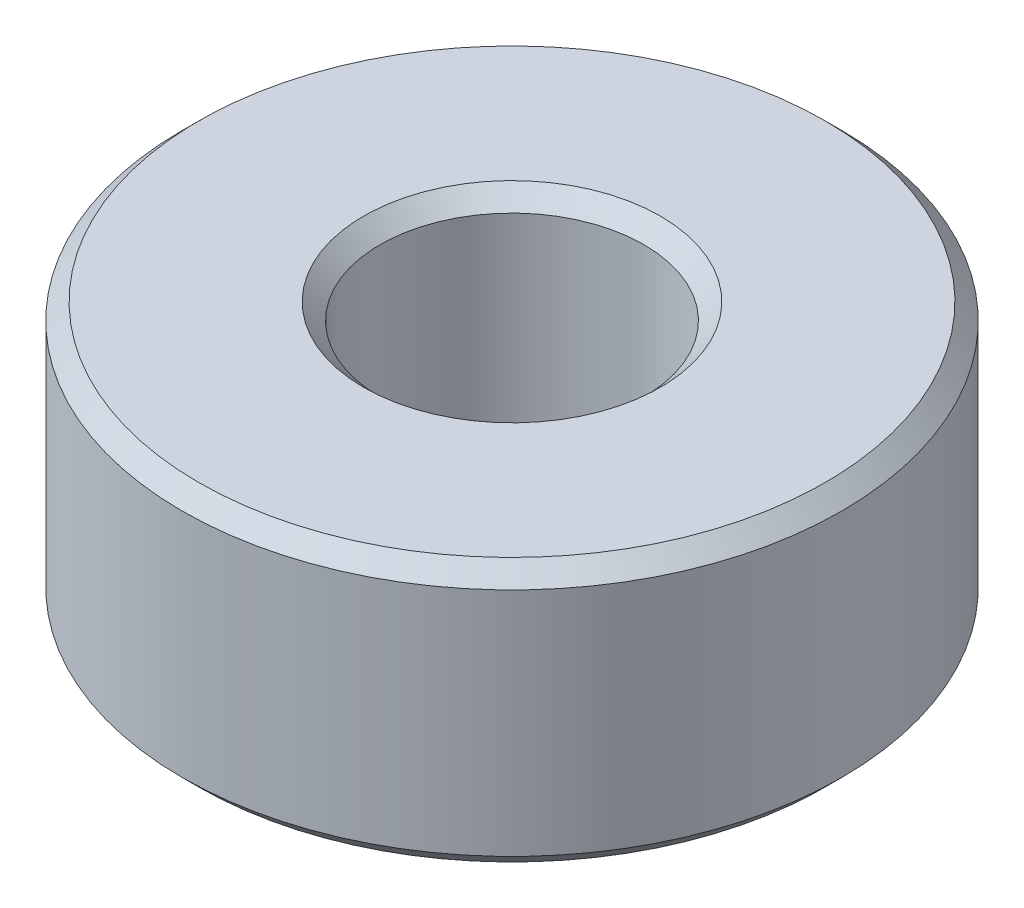
ISO-10303-21;
HEADER;
FILE_DESCRIPTION(('STEP AP214'),'2;1');
FILE_NAME('part.step','',(''),(''),'','','');
FILE_SCHEMA(('AUTOMOTIVE_DESIGN { 1 0 10303 214 1 1 1 1 }'));
ENDSEC;
DATA;
#1=APPLICATION_CONTEXT('core data for automotive mechanical design processes');
#2=APPLICATION_PROTOCOL_DEFINITION('international standard','automotive_design',2000,#1);
#3=PRODUCT_CONTEXT('',#1,'mechanical');
#4=PRODUCT('Part','Part','',(#3));
#5=PRODUCT_RELATED_PRODUCT_CATEGORY('part','',(#4));
#6=PRODUCT_DEFINITION_FORMATION('','',#4);
#7=PRODUCT_DEFINITION_CONTEXT('part definition',#1,'design');
#8=PRODUCT_DEFINITION('design','',#6,#7);
#9=PRODUCT_DEFINITION_SHAPE('','',#8);
#10=(LENGTH_UNIT() NAMED_UNIT(*) SI_UNIT(.MILLI.,.METRE.));
#11=(NAMED_UNIT(*) PLANE_ANGLE_UNIT() SI_UNIT($,.RADIAN.));
#12=(NAMED_UNIT(*) SI_UNIT($,.STERADIAN.) SOLID_ANGLE_UNIT());
#13=UNCERTAINTY_MEASURE_WITH_UNIT(LENGTH_MEASURE(1.E-05),#10,'distance_accuracy_value','');
#14=(GEOMETRIC_REPRESENTATION_CONTEXT(3) GLOBAL_UNCERTAINTY_ASSIGNED_CONTEXT((#13)) GLOBAL_UNIT_ASSIGNED_CONTEXT((#10,
#11,#12)) REPRESENTATION_CONTEXT('',''));
#15=CARTESIAN_POINT('',(0.,0.,0.));
#16=DIRECTION('',(0.,0.,1.));
#17=DIRECTION('',(1.,0.,0.));
#18=AXIS2_PLACEMENT_3D('',#15,#16,#17);
#19=CARTESIAN_POINT('',(0.,2.,0.));
#20=DIRECTION('',(0.,1.,0.));
#21=DIRECTION('',(0.,0.,1.));
#22=AXIS2_PLACEMENT_3D('',#19,#20,#21);
#23=PLANE('',#22);
#24=CARTESIAN_POINT('',(0.,2.,0.));
#25=DIRECTION('',(0.,1.,0.));
#26=DIRECTION('',(0.,0.,1.));
#27=AXIS2_PLACEMENT_3D('',#24,#25,#26);
#28=CIRCLE('',#27,1.125);
#29=CARTESIAN_POINT('',(0.,2.,1.125));
#30=VERTEX_POINT('',#29);
#31=EDGE_CURVE('E55',#30,#30,#28,.F.);
#32=ORIENTED_EDGE('',*,*,#31,.T.);
#33=EDGE_LOOP('',(#32));
#34=FACE_BOUND('',#33,.T.);
#35=CARTESIAN_POINT('',(0.,2.,0.));
#36=DIRECTION('',(0.,1.,0.));
#37=DIRECTION('',(0.,0.,1.));
#38=AXIS2_PLACEMENT_3D('',#35,#36,#37);
#39=CIRCLE('',#38,2.375);
#40=CARTESIAN_POINT('',(0.,2.,2.375));
#41=VERTEX_POINT('',#40);
#42=EDGE_CURVE('E58',#41,#41,#39,.T.);
#43=ORIENTED_EDGE('',*,*,#42,.T.);
#44=EDGE_LOOP('',(#43));
#45=FACE_BOUND('',#44,.T.);
#46=ADVANCED_FACE('F34',(#34,#45),#23,.T.);
#47=CARTESIAN_POINT('',(0.,0.,0.));
#48=DIRECTION('',(0.,1.,0.));
#49=DIRECTION('',(0.,0.,1.));
#50=AXIS2_PLACEMENT_3D('',#47,#48,#49);
#51=PLANE('',#50);
#52=CARTESIAN_POINT('',(0.,0.,0.));
#53=DIRECTION('',(0.,1.,0.));
#54=DIRECTION('',(0.,0.,1.));
#55=AXIS2_PLACEMENT_3D('',#52,#53,#54);
#56=CIRCLE('',#55,1.125);
#57=CARTESIAN_POINT('',(0.,0.,1.125));
#58=VERTEX_POINT('',#57);
#59=EDGE_CURVE('E10',#58,#58,#56,.T.);
#60=ORIENTED_EDGE('',*,*,#59,.T.);
#61=EDGE_LOOP('',(#60));
#62=FACE_BOUND('',#61,.T.);
#63=CARTESIAN_POINT('',(0.,0.,0.));
#64=DIRECTION('',(0.,1.,0.));
#65=DIRECTION('',(0.,0.,1.));
#66=AXIS2_PLACEMENT_3D('',#63,#64,#65);
#67=CIRCLE('',#66,2.375);
#68=CARTESIAN_POINT('',(0.,0.,2.375));
#69=VERTEX_POINT('',#68);
#70=EDGE_CURVE('E42',#69,#69,#67,.F.);
#71=ORIENTED_EDGE('',*,*,#70,.T.);
#72=EDGE_LOOP('',(#71));
#73=FACE_BOUND('',#72,.T.);
#74=ADVANCED_FACE('F84',(#62,#73),#51,.F.);
#75=CARTESIAN_POINT('',(0.,2.,0.));
#76=DIRECTION('',(0.,-1.,0.));
#77=DIRECTION('',(0.,0.,-1.));
#78=AXIS2_PLACEMENT_3D('',#75,#76,#77);
#79=CYLINDRICAL_SURFACE('',#78,2.5);
#80=CARTESIAN_POINT('',(0.,1.875,0.));
#81=DIRECTION('',(0.,1.,0.));
#82=DIRECTION('',(0.,0.,1.));
#83=AXIS2_PLACEMENT_3D('',#80,#81,#82);
#84=CIRCLE('',#83,2.5);
#85=CARTESIAN_POINT('',(0.,1.875,2.5));
#86=VERTEX_POINT('',#85);
#87=EDGE_CURVE('E46',#86,#86,#84,.F.);
#88=ORIENTED_EDGE('',*,*,#87,.T.);
#89=EDGE_LOOP('',(#88));
#90=FACE_BOUND('',#89,.T.);
#91=CARTESIAN_POINT('',(0.,0.125,0.));
#92=DIRECTION('',(0.,1.,0.));
#93=DIRECTION('',(0.,0.,1.));
#94=AXIS2_PLACEMENT_3D('',#91,#92,#93);
#95=CIRCLE('',#94,2.5);
#96=CARTESIAN_POINT('',(0.,0.125,2.5));
#97=VERTEX_POINT('',#96);
#98=EDGE_CURVE('E50',#97,#97,#95,.T.);
#99=ORIENTED_EDGE('',*,*,#98,.T.);
#100=EDGE_LOOP('',(#99));
#101=FACE_BOUND('',#100,.T.);
#102=ADVANCED_FACE('F90',(#90,#101),#79,.T.);
#103=CARTESIAN_POINT('',(0.,2.,0.));
#104=DIRECTION('',(0.,-1.,0.));
#105=DIRECTION('',(0.,0.,-1.));
#106=AXIS2_PLACEMENT_3D('',#103,#104,#105);
#107=CYLINDRICAL_SURFACE('',#106,1.);
#108=CARTESIAN_POINT('',(0.,1.875,0.));
#109=DIRECTION('',(0.,1.,0.));
#110=DIRECTION('',(0.,0.,1.));
#111=AXIS2_PLACEMENT_3D('',#108,#109,#110);
#112=CIRCLE('',#111,1.);
#113=CARTESIAN_POINT('',(0.,1.875,1.));
#114=VERTEX_POINT('',#113);
#115=EDGE_CURVE('E61',#114,#114,#112,.T.);
#116=ORIENTED_EDGE('',*,*,#115,.T.);
#117=EDGE_LOOP('',(#116));
#118=FACE_BOUND('',#117,.T.);
#119=CARTESIAN_POINT('',(0.,0.124999999999999,0.));
#120=DIRECTION('',(0.,1.,0.));
#121=DIRECTION('',(0.,0.,1.));
#122=AXIS2_PLACEMENT_3D('',#119,#120,#121);
#123=CIRCLE('',#122,1.);
#124=CARTESIAN_POINT('',(0.,0.124999999999999,1.));
#125=VERTEX_POINT('',#124);
#126=EDGE_CURVE('E64',#125,#125,#123,.F.);
#127=ORIENTED_EDGE('',*,*,#126,.T.);
#128=EDGE_LOOP('',(#127));
#129=FACE_BOUND('',#128,.T.);
#130=ADVANCED_FACE('F68',(#118,#129),#107,.F.);
#131=CARTESIAN_POINT('',(0.,1.875,0.));
#132=DIRECTION('',(0.,1.,0.));
#133=DIRECTION('',(0.,0.,1.));
#134=AXIS2_PLACEMENT_3D('',#131,#132,#133);
#135=CONICAL_SURFACE('',#134,1.,0.785398163397448);
#136=ORIENTED_EDGE('',*,*,#31,.F.);
#137=EDGE_LOOP('',(#136));
#138=FACE_BOUND('',#137,.T.);
#139=ORIENTED_EDGE('',*,*,#115,.F.);
#140=EDGE_LOOP('',(#139));
#141=FACE_BOUND('',#140,.T.);
#142=ADVANCED_FACE('F79',(#138,#141),#135,.F.);
#143=CARTESIAN_POINT('',(0.,2.,0.));
#144=DIRECTION('',(0.,-1.,0.));
#145=DIRECTION('',(0.,0.,-1.));
#146=AXIS2_PLACEMENT_3D('',#143,#144,#145);
#147=CONICAL_SURFACE('',#146,2.375,0.785398163397445);
#148=ORIENTED_EDGE('',*,*,#87,.F.);
#149=EDGE_LOOP('',(#148));
#150=FACE_BOUND('',#149,.T.);
#151=ORIENTED_EDGE('',*,*,#42,.F.);
#152=EDGE_LOOP('',(#151));
#153=FACE_BOUND('',#152,.T.);
#154=ADVANCED_FACE('F73',(#150,#153),#147,.T.);
#155=CARTESIAN_POINT('',(0.,0.,0.));
#156=DIRECTION('',(0.,-1.,0.));
#157=DIRECTION('',(0.,0.,-1.));
#158=AXIS2_PLACEMENT_3D('',#155,#156,#157);
#159=CONICAL_SURFACE('',#158,1.125,0.785398163397445);
#160=ORIENTED_EDGE('',*,*,#126,.F.);
#161=EDGE_LOOP('',(#160));
#162=FACE_BOUND('',#161,.T.);
#163=ORIENTED_EDGE('',*,*,#59,.F.);
#164=EDGE_LOOP('',(#163));
#165=FACE_BOUND('',#164,.T.);
#166=ADVANCED_FACE('F70',(#162,#165),#159,.F.);
#167=CARTESIAN_POINT('',(0.,0.125,0.));
#168=DIRECTION('',(0.,1.,0.));
#169=DIRECTION('',(0.,0.,1.));
#170=AXIS2_PLACEMENT_3D('',#167,#168,#169);
#171=CONICAL_SURFACE('',#170,2.5,0.78539816339745);
#172=ORIENTED_EDGE('',*,*,#70,.F.);
#173=EDGE_LOOP('',(#172));
#174=FACE_BOUND('',#173,.T.);
#175=ORIENTED_EDGE('',*,*,#98,.F.);
#176=EDGE_LOOP('',(#175));
#177=FACE_BOUND('',#176,.T.);
#178=ADVANCED_FACE('F37',(#174,#177),#171,.T.);
#179=CLOSED_SHELL('',(#46,#74,#102,#130,#142,#154,#166,#178));
#180=MANIFOLD_SOLID_BREP('B2',#179);
#181=ADVANCED_BREP_SHAPE_REPRESENTATION('',(#18,#180),#14);
#182=SHAPE_DEFINITION_REPRESENTATION(#9,#181);
ENDSEC;
END-ISO-10303-21;
